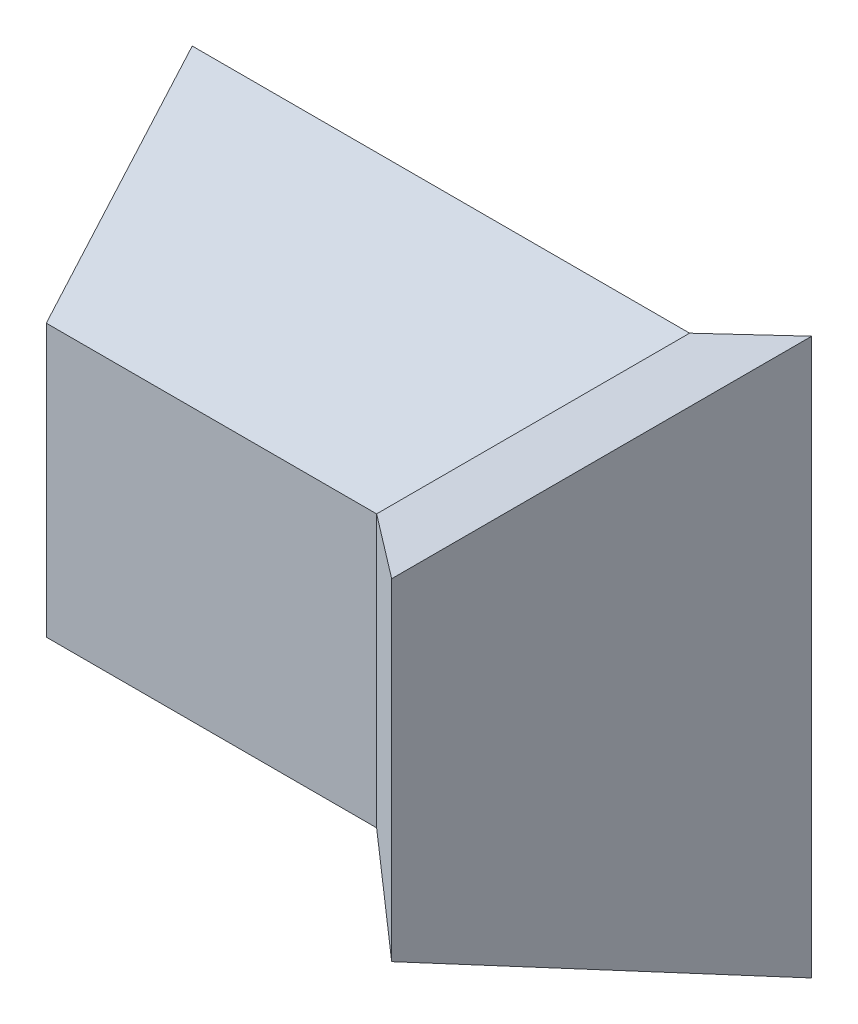
ISO-10303-21;
HEADER;
FILE_DESCRIPTION(('STEP AP214'),'2;1');
FILE_NAME('part.step','',(''),(''),'','','');
FILE_SCHEMA(('AUTOMOTIVE_DESIGN { 1 0 10303 214 1 1 1 1 }'));
ENDSEC;
DATA;
#1=APPLICATION_CONTEXT('core data for automotive mechanical design processes');
#2=APPLICATION_PROTOCOL_DEFINITION('international standard','automotive_design',2000,#1);
#3=PRODUCT_CONTEXT('',#1,'mechanical');
#4=PRODUCT('Part','Part','',(#3));
#5=PRODUCT_RELATED_PRODUCT_CATEGORY('part','',(#4));
#6=PRODUCT_DEFINITION_FORMATION('','',#4);
#7=PRODUCT_DEFINITION_CONTEXT('part definition',#1,'design');
#8=PRODUCT_DEFINITION('design','',#6,#7);
#9=PRODUCT_DEFINITION_SHAPE('','',#8);
#10=(LENGTH_UNIT() NAMED_UNIT(*) SI_UNIT(.MILLI.,.METRE.));
#11=(NAMED_UNIT(*) PLANE_ANGLE_UNIT() SI_UNIT($,.RADIAN.));
#12=(NAMED_UNIT(*) SI_UNIT($,.STERADIAN.) SOLID_ANGLE_UNIT());
#13=UNCERTAINTY_MEASURE_WITH_UNIT(LENGTH_MEASURE(1.E-05),#10,'distance_accuracy_value','');
#14=(GEOMETRIC_REPRESENTATION_CONTEXT(3) GLOBAL_UNCERTAINTY_ASSIGNED_CONTEXT((#13)) GLOBAL_UNIT_ASSIGNED_CONTEXT((#10,
#11,#12)) REPRESENTATION_CONTEXT('',''));
#15=CARTESIAN_POINT('',(0.,0.,0.));
#16=DIRECTION('',(0.,0.,1.));
#17=DIRECTION('',(1.,0.,0.));
#18=AXIS2_PLACEMENT_3D('',#15,#16,#17);
#19=CARTESIAN_POINT('',(43.3507233163141,0.,0.));
#20=DIRECTION('',(0.,0.,-1.));
#21=DIRECTION('',(-1.,0.,0.));
#22=AXIS2_PLACEMENT_3D('',#19,#20,#21);
#23=PLANE('',#22);
#24=DIRECTION('',(0.,1.,0.));
#25=VECTOR('',#24,1.);
#26=CARTESIAN_POINT('',(43.3507233163141,0.,0.));
#27=LINE('',#26,#25);
#28=CARTESIAN_POINT('',(43.3507233163141,-38.2597131047897,0.));
#29=VERTEX_POINT('',#28);
#30=CARTESIAN_POINT('',(43.3507233163141,0.,0.));
#31=VERTEX_POINT('',#30);
#32=EDGE_CURVE('E94',#29,#31,#27,.T.);
#33=ORIENTED_EDGE('',*,*,#32,.T.);
#34=DIRECTION('',(0.902068090463861,0.431593744355597,0.));
#35=VECTOR('',#34,1.);
#36=CARTESIAN_POINT('',(43.3507233163141,0.,0.));
#37=LINE('',#36,#35);
#38=CARTESIAN_POINT('',(53.9925010410732,5.09154989892947,0.));
#39=VERTEX_POINT('',#38);
#40=EDGE_CURVE('E12',#39,#31,#37,.F.);
#41=ORIENTED_EDGE('',*,*,#40,.F.);
#42=DIRECTION('',(0.,1.,0.));
#43=VECTOR('',#42,1.);
#44=CARTESIAN_POINT('',(53.9925010410732,0.,0.));
#45=LINE('',#44,#43);
#46=CARTESIAN_POINT('',(53.9925010410732,-43.3512630037192,0.));
#47=VERTEX_POINT('',#46);
#48=EDGE_CURVE('E109',#47,#39,#45,.T.);
#49=ORIENTED_EDGE('',*,*,#48,.F.);
#50=DIRECTION('',(-0.902068090463861,0.431593744355597,0.));
#51=VECTOR('',#50,1.);
#52=CARTESIAN_POINT('',(28.4551861032688,-31.1329554376822,0.));
#53=LINE('',#52,#51);
#54=EDGE_CURVE('E102',#47,#29,#53,.T.);
#55=ORIENTED_EDGE('',*,*,#54,.T.);
#56=EDGE_LOOP('',(#33,#41,#49,#55));
#57=FACE_BOUND('',#56,.T.);
#58=ADVANCED_FACE('F50',(#57),#23,.T.);
#59=CARTESIAN_POINT('',(38.8107303055205,-4.53999301079362,12.4735282816372));
#60=DIRECTION('',(-0.425401846479835,0.889126490715988,0.168781967397644));
#61=DIRECTION('',(-0.902068090463861,-0.431593744355597,0.));
#62=AXIS2_PLACEMENT_3D('',#59,#60,#61);
#63=PLANE('',#62);
#64=DIRECTION('',(0.323615577118185,0.323615577118185,-0.889126490715988));
#65=VECTOR('',#64,1.);
#66=CARTESIAN_POINT('',(38.8107303055205,-4.53999301079362,12.4735282816372));
#67=LINE('',#66,#65);
#68=CARTESIAN_POINT('',(36.0713186309901,-7.27940468532406,20.));
#69=VERTEX_POINT('',#68);
#70=EDGE_CURVE('E88',#69,#31,#67,.T.);
#71=ORIENTED_EDGE('',*,*,#70,.F.);
#72=DIRECTION('',(-0.744126367903877,-0.237498174512315,-0.624396160857434));
#73=VECTOR('',#72,1.);
#74=CARTESIAN_POINT('',(37.3577980228297,-6.86880707678846,21.0794843832098));
#75=LINE('',#74,#73);
#76=CARTESIAN_POINT('',(44.2233933219491,-4.67755782019468,26.8404028665134));
#77=VERTEX_POINT('',#76);
#78=EDGE_CURVE('E57',#77,#69,#75,.T.);
#79=ORIENTED_EDGE('',*,*,#78,.F.);
#80=DIRECTION('',(-0.323615577118185,-0.323615577118185,0.889126490715988));
#81=VECTOR('',#80,1.);
#82=CARTESIAN_POINT('',(52.3447961821051,3.44384503996137,4.5270318939405));
#83=LINE('',#82,#81);
#84=EDGE_CURVE('E106',#77,#39,#83,.F.);
#85=ORIENTED_EDGE('',*,*,#84,.T.);
#86=ORIENTED_EDGE('',*,*,#40,.T.);
#87=EDGE_LOOP('',(#71,#79,#85,#86));
#88=FACE_BOUND('',#87,.T.);
#89=ADVANCED_FACE('F51',(#88),#63,.T.);
#90=CARTESIAN_POINT('',(36.0713186309901,0.,20.));
#91=DIRECTION('',(-0.64278760968654,0.,0.766044443118977));
#92=DIRECTION('',(0.766044443118977,0.,0.642787609686541));
#93=AXIS2_PLACEMENT_3D('',#90,#91,#92);
#94=PLANE('',#93);
#95=DIRECTION('',(0.,-1.,0.));
#96=VECTOR('',#95,1.);
#97=CARTESIAN_POINT('',(36.0713186309901,0.,20.));
#98=LINE('',#97,#96);
#99=CARTESIAN_POINT('',(36.0713186309901,-30.9803084194656,20.));
#100=VERTEX_POINT('',#99);
#101=EDGE_CURVE('E93',#100,#69,#98,.F.);
#102=ORIENTED_EDGE('',*,*,#101,.F.);
#103=DIRECTION('',(0.744126367903877,-0.237498174512315,0.624396160857434));
#104=VECTOR('',#103,1.);
#105=CARTESIAN_POINT('',(30.5962104240196,-29.2328522608084,15.4058387228753));
#106=LINE('',#105,#104);
#107=CARTESIAN_POINT('',(44.2233933219491,-33.582155284595,26.8404028665134));
#108=VERTEX_POINT('',#107);
#109=EDGE_CURVE('E72',#108,#100,#106,.F.);
#110=ORIENTED_EDGE('',*,*,#109,.F.);
#111=DIRECTION('',(0.,-1.,0.));
#112=VECTOR('',#111,1.);
#113=CARTESIAN_POINT('',(44.2233933219491,0.,26.8404028665134));
#114=LINE('',#113,#112);
#115=EDGE_CURVE('E108',#108,#77,#114,.F.);
#116=ORIENTED_EDGE('',*,*,#115,.T.);
#117=ORIENTED_EDGE('',*,*,#78,.T.);
#118=EDGE_LOOP('',(#102,#110,#116,#117));
#119=FACE_BOUND('',#118,.T.);
#120=ADVANCED_FACE('F123',(#119),#94,.T.);
#121=CARTESIAN_POINT('',(39.3438967445105,-34.2528865329861,11.0086655297012));
#122=DIRECTION('',(-0.425401846479835,-0.889126490715988,0.168781967397644));
#123=DIRECTION('',(0.902068090463861,-0.431593744355597,0.));
#124=AXIS2_PLACEMENT_3D('',#121,#122,#123);
#125=PLANE('',#124);
#126=DIRECTION('',(0.323615577118185,-0.323615577118185,-0.889126490715988));
#127=VECTOR('',#126,1.);
#128=CARTESIAN_POINT('',(39.3438967445105,-34.2528865329861,11.0086655297012));
#129=LINE('',#128,#127);
#130=EDGE_CURVE('E111',#100,#29,#129,.T.);
#131=ORIENTED_EDGE('',*,*,#130,.T.);
#132=ORIENTED_EDGE('',*,*,#54,.F.);
#133=DIRECTION('',(0.323615577118185,-0.323615577118185,-0.889126490715988));
#134=VECTOR('',#133,1.);
#135=CARTESIAN_POINT('',(48.3379696103015,-37.6967315729474,15.5356974236417));
#136=LINE('',#135,#134);
#137=EDGE_CURVE('E53',#108,#47,#136,.T.);
#138=ORIENTED_EDGE('',*,*,#137,.F.);
#139=ORIENTED_EDGE('',*,*,#109,.T.);
#140=EDGE_LOOP('',(#131,#132,#138,#139));
#141=FACE_BOUND('',#140,.T.);
#142=ADVANCED_FACE('F126',(#141),#125,.T.);
#143=CARTESIAN_POINT('',(52.7476495241732,0.,3.42020143325669));
#144=DIRECTION('',(0.939692620785908,0.,0.342020143325669));
#145=DIRECTION('',(0.342020143325669,0.,-0.939692620785908));
#146=AXIS2_PLACEMENT_3D('',#143,#144,#145);
#147=PLANE('',#146);
#148=ORIENTED_EDGE('',*,*,#48,.T.);
#149=ORIENTED_EDGE('',*,*,#84,.F.);
#150=ORIENTED_EDGE('',*,*,#115,.F.);
#151=ORIENTED_EDGE('',*,*,#137,.T.);
#152=EDGE_LOOP('',(#148,#149,#150,#151));
#153=FACE_BOUND('',#152,.T.);
#154=ADVANCED_FACE('F124',(#153),#147,.T.);
#155=OPEN_SHELL('',(#58,#89,#120,#142,#154));
#156=SHELL_BASED_SURFACE_MODEL('B2',(#155));
#157=CARTESIAN_POINT('',(0.,0.,0.));
#158=DIRECTION('',(-0.939692620785908,0.,0.342020143325669));
#159=DIRECTION('',(0.342020143325669,0.,0.939692620785908));
#160=AXIS2_PLACEMENT_3D('',#157,#158,#159);
#161=PLANE('',#160);
#162=DIRECTION('',(0.,-1.,0.));
#163=VECTOR('',#162,1.);
#164=CARTESIAN_POINT('',(0.,0.,0.));
#165=LINE('',#164,#163);
#166=CARTESIAN_POINT('',(0.,0.,0.));
#167=VERTEX_POINT('',#166);
#168=CARTESIAN_POINT('',(0.,-38.2597131047897,0.));
#169=VERTEX_POINT('',#168);
#170=EDGE_CURVE('E219',#167,#169,#165,.T.);
#171=ORIENTED_EDGE('',*,*,#170,.T.);
#172=DIRECTION('',(-0.323615577118185,-0.323615577118185,-0.889126490715988));
#173=VECTOR('',#172,1.);
#174=CARTESIAN_POINT('',(0.,-38.2597131047897,0.));
#175=LINE('',#174,#173);
#176=CARTESIAN_POINT('',(7.27940468532406,-30.9803084194656,20.));
#177=VERTEX_POINT('',#176);
#178=EDGE_CURVE('E48',#177,#169,#175,.T.);
#179=ORIENTED_EDGE('',*,*,#178,.F.);
#180=DIRECTION('',(0.,1.,0.));
#181=VECTOR('',#180,1.);
#182=CARTESIAN_POINT('',(7.27940468532406,0.,20.));
#183=LINE('',#182,#181);
#184=CARTESIAN_POINT('',(7.27940468532406,-7.27940468532406,20.));
#185=VERTEX_POINT('',#184);
#186=EDGE_CURVE('E236',#185,#177,#183,.F.);
#187=ORIENTED_EDGE('',*,*,#186,.F.);
#188=DIRECTION('',(-0.323615577118185,0.323615577118185,-0.889126490715988));
#189=VECTOR('',#188,1.);
#190=CARTESIAN_POINT('',(0.,0.,0.));
#191=LINE('',#190,#189);
#192=EDGE_CURVE('E230',#185,#167,#191,.T.);
#193=ORIENTED_EDGE('',*,*,#192,.T.);
#194=EDGE_LOOP('',(#171,#179,#187,#193));
#195=FACE_BOUND('',#194,.T.);
#196=ADVANCED_FACE('F173',(#195),#161,.T.);
#197=CARTESIAN_POINT('',(0.,-38.2597131047897,0.));
#198=DIRECTION('',(0.,-0.939692620785908,0.342020143325669));
#199=DIRECTION('',(0.,-0.342020143325669,-0.939692620785908));
#200=AXIS2_PLACEMENT_3D('',#197,#198,#199);
#201=PLANE('',#200);
#202=DIRECTION('',(1.,0.,0.));
#203=VECTOR('',#202,1.);
#204=CARTESIAN_POINT('',(0.,-38.2597131047897,0.));
#205=LINE('',#204,#203);
#206=CARTESIAN_POINT('',(43.3507233163141,-38.2597131047897,0.));
#207=VERTEX_POINT('',#206);
#208=EDGE_CURVE('E215',#169,#207,#205,.T.);
#209=ORIENTED_EDGE('',*,*,#208,.T.);
#210=DIRECTION('',(0.323615577118185,-0.323615577118185,-0.889126490715988));
#211=VECTOR('',#210,1.);
#212=CARTESIAN_POINT('',(39.3438967445105,-34.2528865329861,11.0086655297012));
#213=LINE('',#212,#211);
#214=CARTESIAN_POINT('',(36.0713186309901,-30.9803084194656,20.));
#215=VERTEX_POINT('',#214);
#216=EDGE_CURVE('E182',#215,#207,#213,.T.);
#217=ORIENTED_EDGE('',*,*,#216,.F.);
#218=DIRECTION('',(-1.,0.,0.));
#219=VECTOR('',#218,1.);
#220=CARTESIAN_POINT('',(0.,-30.9803084194656,20.));
#221=LINE('',#220,#219);
#222=EDGE_CURVE('E226',#177,#215,#221,.F.);
#223=ORIENTED_EDGE('',*,*,#222,.F.);
#224=ORIENTED_EDGE('',*,*,#178,.T.);
#225=EDGE_LOOP('',(#209,#217,#223,#224));
#226=FACE_BOUND('',#225,.T.);
#227=ADVANCED_FACE('F175',(#226),#201,.T.);
#228=CARTESIAN_POINT('',(43.3507233163141,0.,0.));
#229=DIRECTION('',(0.939692620785908,0.,0.342020143325669));
#230=DIRECTION('',(0.342020143325669,0.,-0.939692620785908));
#231=AXIS2_PLACEMENT_3D('',#228,#229,#230);
#232=PLANE('',#231);
#233=DIRECTION('',(0.,1.,0.));
#234=VECTOR('',#233,1.);
#235=CARTESIAN_POINT('',(43.3507233163141,0.,0.));
#236=LINE('',#235,#234);
#237=CARTESIAN_POINT('',(43.3507233163141,0.,0.));
#238=VERTEX_POINT('',#237);
#239=EDGE_CURVE('E220',#207,#238,#236,.T.);
#240=ORIENTED_EDGE('',*,*,#239,.T.);
#241=DIRECTION('',(0.323615577118185,0.323615577118185,-0.889126490715988));
#242=VECTOR('',#241,1.);
#243=CARTESIAN_POINT('',(38.8107303055205,-4.53999301079362,12.4735282816372));
#244=LINE('',#243,#242);
#245=CARTESIAN_POINT('',(36.0713186309901,-7.27940468532406,20.));
#246=VERTEX_POINT('',#245);
#247=EDGE_CURVE('E239',#246,#238,#244,.T.);
#248=ORIENTED_EDGE('',*,*,#247,.F.);
#249=DIRECTION('',(0.,-1.,0.));
#250=VECTOR('',#249,1.);
#251=CARTESIAN_POINT('',(36.0713186309901,0.,20.));
#252=LINE('',#251,#250);
#253=EDGE_CURVE('E194',#215,#246,#252,.F.);
#254=ORIENTED_EDGE('',*,*,#253,.F.);
#255=ORIENTED_EDGE('',*,*,#216,.T.);
#256=EDGE_LOOP('',(#240,#248,#254,#255));
#257=FACE_BOUND('',#256,.T.);
#258=ADVANCED_FACE('F249',(#257),#232,.T.);
#259=CARTESIAN_POINT('',(0.,0.,0.));
#260=DIRECTION('',(0.,0.939692620785908,0.342020143325669));
#261=DIRECTION('',(0.,-0.342020143325669,0.939692620785908));
#262=AXIS2_PLACEMENT_3D('',#259,#260,#261);
#263=PLANE('',#262);
#264=DIRECTION('',(-1.,0.,0.));
#265=VECTOR('',#264,1.);
#266=CARTESIAN_POINT('',(0.,0.,0.));
#267=LINE('',#266,#265);
#268=EDGE_CURVE('E235',#238,#167,#267,.T.);
#269=ORIENTED_EDGE('',*,*,#268,.T.);
#270=ORIENTED_EDGE('',*,*,#192,.F.);
#271=DIRECTION('',(1.,0.,0.));
#272=VECTOR('',#271,1.);
#273=CARTESIAN_POINT('',(0.,-7.27940468532406,20.));
#274=LINE('',#273,#272);
#275=EDGE_CURVE('E177',#246,#185,#274,.F.);
#276=ORIENTED_EDGE('',*,*,#275,.F.);
#277=ORIENTED_EDGE('',*,*,#247,.T.);
#278=EDGE_LOOP('',(#269,#270,#276,#277));
#279=FACE_BOUND('',#278,.T.);
#280=ADVANCED_FACE('F251',(#279),#263,.T.);
#281=CARTESIAN_POINT('',(0.,0.,20.));
#282=DIRECTION('',(0.,0.,1.));
#283=DIRECTION('',(1.,0.,0.));
#284=AXIS2_PLACEMENT_3D('',#281,#282,#283);
#285=PLANE('',#284);
#286=ORIENTED_EDGE('',*,*,#186,.T.);
#287=ORIENTED_EDGE('',*,*,#222,.T.);
#288=ORIENTED_EDGE('',*,*,#253,.T.);
#289=ORIENTED_EDGE('',*,*,#275,.T.);
#290=EDGE_LOOP('',(#286,#287,#288,#289));
#291=FACE_BOUND('',#290,.T.);
#292=ADVANCED_FACE('F247',(#291),#285,.T.);
#293=CARTESIAN_POINT('',(0.,0.,0.));
#294=DIRECTION('',(0.,0.,1.));
#295=DIRECTION('',(1.,0.,0.));
#296=AXIS2_PLACEMENT_3D('',#293,#294,#295);
#297=PLANE('',#296);
#298=ORIENTED_EDGE('',*,*,#170,.F.);
#299=ORIENTED_EDGE('',*,*,#268,.F.);
#300=ORIENTED_EDGE('',*,*,#239,.F.);
#301=ORIENTED_EDGE('',*,*,#208,.F.);
#302=EDGE_LOOP('',(#298,#299,#300,#301));
#303=FACE_BOUND('',#302,.T.);
#304=ADVANCED_FACE('F216',(#303),#297,.F.);
#305=CLOSED_SHELL('',(#196,#227,#258,#280,#292,#304));
#306=MANIFOLD_SOLID_BREP('B6',#305);
#307=ADVANCED_BREP_SHAPE_REPRESENTATION('',(#18,#306),#14);
#308=MANIFOLD_SURFACE_SHAPE_REPRESENTATION('',(#18,#156),#14);
#309=SHAPE_REPRESENTATION('',(#18),#14);
#310=SHAPE_DEFINITION_REPRESENTATION(#9,#309);
#311=SHAPE_REPRESENTATION_RELATIONSHIP('','',#309,#307);
#312=SHAPE_REPRESENTATION_RELATIONSHIP('','',#309,#308);
ENDSEC;
END-ISO-10303-21;
